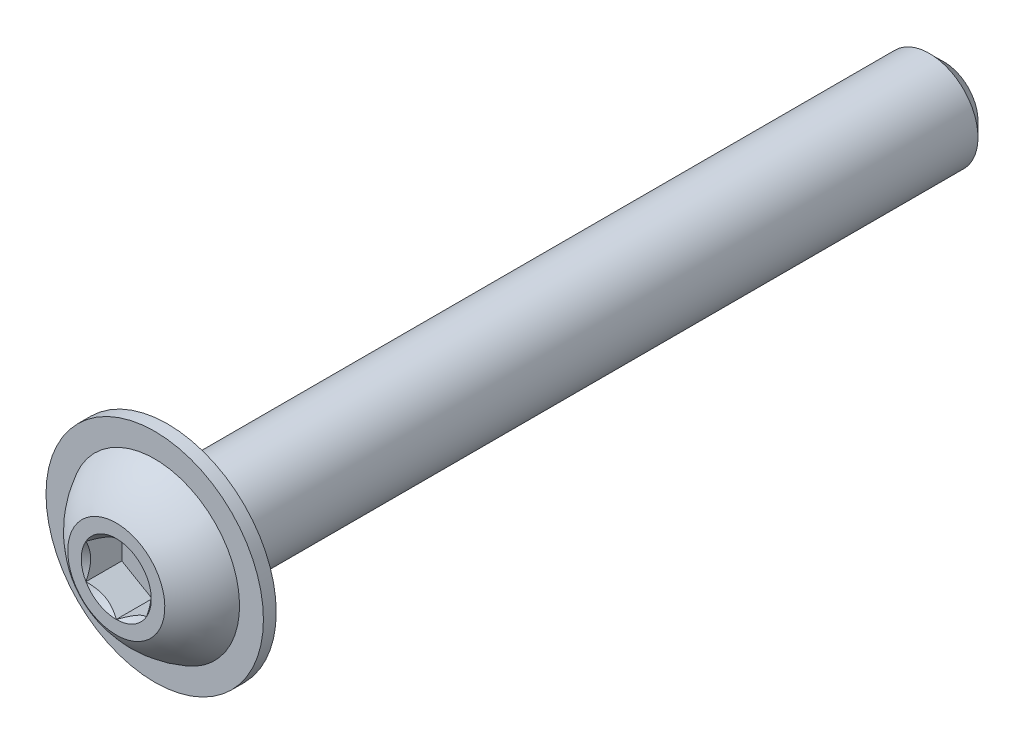
ISO-10303-21;
HEADER;
FILE_DESCRIPTION(('STEP AP214'),'2;1');
FILE_NAME('part.step','',(''),(''),'','','');
FILE_SCHEMA(('AUTOMOTIVE_DESIGN { 1 0 10303 214 1 1 1 1 }'));
ENDSEC;
DATA;
#1=APPLICATION_CONTEXT('core data for automotive mechanical design processes');
#2=APPLICATION_PROTOCOL_DEFINITION('international standard','automotive_design',2000,#1);
#3=PRODUCT_CONTEXT('',#1,'mechanical');
#4=PRODUCT('Part','Part','',(#3));
#5=PRODUCT_RELATED_PRODUCT_CATEGORY('part','',(#4));
#6=PRODUCT_DEFINITION_FORMATION('','',#4);
#7=PRODUCT_DEFINITION_CONTEXT('part definition',#1,'design');
#8=PRODUCT_DEFINITION('design','',#6,#7);
#9=PRODUCT_DEFINITION_SHAPE('','',#8);
#10=(LENGTH_UNIT() NAMED_UNIT(*) SI_UNIT(.MILLI.,.METRE.));
#11=(NAMED_UNIT(*) PLANE_ANGLE_UNIT() SI_UNIT($,.RADIAN.));
#12=(NAMED_UNIT(*) SI_UNIT($,.STERADIAN.) SOLID_ANGLE_UNIT());
#13=UNCERTAINTY_MEASURE_WITH_UNIT(LENGTH_MEASURE(1.E-05),#10,'distance_accuracy_value','');
#14=(GEOMETRIC_REPRESENTATION_CONTEXT(3) GLOBAL_UNCERTAINTY_ASSIGNED_CONTEXT((#13)) GLOBAL_UNIT_ASSIGNED_CONTEXT((#10,
#11,#12)) REPRESENTATION_CONTEXT('',''));
#15=CARTESIAN_POINT('',(0.,0.,0.));
#16=DIRECTION('',(0.,0.,1.));
#17=DIRECTION('',(1.,0.,0.));
#18=AXIS2_PLACEMENT_3D('',#15,#16,#17);
#19=CARTESIAN_POINT('',(0.,-3.175,-54.1528));
#20=DIRECTION('',(0.,0.,-1.));
#21=DIRECTION('',(0.,1.,0.));
#22=AXIS2_PLACEMENT_3D('',#19,#20,#21);
#23=PLANE('',#22);
#24=CARTESIAN_POINT('',(0.,0.,-54.1528));
#25=DIRECTION('',(0.,0.,-1.));
#26=DIRECTION('',(0.,1.,0.));
#27=AXIS2_PLACEMENT_3D('',#24,#25,#26);
#28=CIRCLE('',#27,2.2225);
#29=CARTESIAN_POINT('',(0.,-2.22249999999999,-54.1528));
#30=VERTEX_POINT('',#29);
#31=EDGE_CURVE('E176',#30,#30,#28,.T.);
#32=ORIENTED_EDGE('',*,*,#31,.T.);
#33=EDGE_LOOP('',(#32));
#34=FACE_BOUND('',#33,.T.);
#35=ADVANCED_FACE('F34',(#34),#23,.T.);
#36=CARTESIAN_POINT('',(0.,0.,-54.1528));
#37=DIRECTION('',(0.,0.,-1.));
#38=DIRECTION('',(0.,1.,0.));
#39=AXIS2_PLACEMENT_3D('',#36,#37,#38);
#40=CYLINDRICAL_SURFACE('',#39,3.175);
#41=CARTESIAN_POINT('',(0.,0.,-53.2003));
#42=DIRECTION('',(0.,0.,-1.));
#43=DIRECTION('',(0.,1.,0.));
#44=AXIS2_PLACEMENT_3D('',#41,#42,#43);
#45=CIRCLE('',#44,3.175);
#46=CARTESIAN_POINT('',(0.,-3.175,-53.2003));
#47=VERTEX_POINT('',#46);
#48=EDGE_CURVE('E47',#47,#47,#45,.F.);
#49=ORIENTED_EDGE('',*,*,#48,.T.);
#50=EDGE_LOOP('',(#49));
#51=FACE_BOUND('',#50,.T.);
#52=CARTESIAN_POINT('',(0.,0.,-3.3528));
#53=DIRECTION('',(0.,0.,1.));
#54=DIRECTION('',(1.,0.,0.));
#55=AXIS2_PLACEMENT_3D('',#52,#53,#54);
#56=CIRCLE('',#55,3.175);
#57=CARTESIAN_POINT('',(3.175,0.,-3.3528));
#58=VERTEX_POINT('',#57);
#59=EDGE_CURVE('E173',#58,#58,#56,.F.);
#60=ORIENTED_EDGE('',*,*,#59,.T.);
#61=EDGE_LOOP('',(#60));
#62=FACE_BOUND('',#61,.T.);
#63=ADVANCED_FACE('F181',(#51,#62),#40,.T.);
#64=CARTESIAN_POINT('',(0.,0.,-54.1528));
#65=DIRECTION('',(0.,0.,1.));
#66=DIRECTION('',(0.,-1.,0.));
#67=AXIS2_PLACEMENT_3D('',#64,#65,#66);
#68=CONICAL_SURFACE('',#67,2.2225,0.78539816339745);
#69=CARTESIAN_POINT('',(0.,-3.175,-53.2003));
#70=CARTESIAN_POINT('',(0.,-3.165078125,-53.210221875));
#71=CARTESIAN_POINT('',(0.,-3.15515625,-53.22014375));
#72=CARTESIAN_POINT('',(0.,-3.1353125,-53.2399875));
#73=CARTESIAN_POINT('',(0.,-3.12539062499999,-53.249909375));
#74=CARTESIAN_POINT('',(0.,-3.105546875,-53.269753125));
#75=CARTESIAN_POINT('',(0.,-3.095625,-53.279675));
#76=CARTESIAN_POINT('',(0.,-3.07578125,-53.29951875));
#77=CARTESIAN_POINT('',(0.,-3.06585937499999,-53.309440625));
#78=CARTESIAN_POINT('',(0.,-3.04601562499999,-53.329284375));
#79=CARTESIAN_POINT('',(0.,-3.03609375,-53.33920625));
#80=CARTESIAN_POINT('',(0.,-3.01625,-53.35905));
#81=CARTESIAN_POINT('',(0.,-3.006328125,-53.368971875));
#82=CARTESIAN_POINT('',(0.,-2.98648437499999,-53.388815625));
#83=CARTESIAN_POINT('',(0.,-2.97656249999999,-53.3987375));
#84=CARTESIAN_POINT('',(0.,-2.95671874999999,-53.41858125));
#85=CARTESIAN_POINT('',(0.,-2.946796875,-53.428503125));
#86=CARTESIAN_POINT('',(0.,-2.92695312499999,-53.448346875));
#87=CARTESIAN_POINT('',(0.,-2.91703124999999,-53.45826875));
#88=CARTESIAN_POINT('',(0.,-2.89718749999999,-53.4781125));
#89=CARTESIAN_POINT('',(0.,-2.887265625,-53.488034375));
#90=CARTESIAN_POINT('',(0.,-2.867421875,-53.507878125));
#91=CARTESIAN_POINT('',(0.,-2.85749999999999,-53.5178));
#92=CARTESIAN_POINT('',(0.,-2.83765624999999,-53.53764375));
#93=CARTESIAN_POINT('',(0.,-2.82773437499999,-53.547565625));
#94=CARTESIAN_POINT('',(0.,-2.80789062499999,-53.567409375));
#95=CARTESIAN_POINT('',(0.,-2.79796874999999,-53.57733125));
#96=CARTESIAN_POINT('',(0.,-2.77812499999999,-53.597175));
#97=CARTESIAN_POINT('',(0.,-2.76820312499999,-53.607096875));
#98=CARTESIAN_POINT('',(0.,-2.74835937499999,-53.626940625));
#99=CARTESIAN_POINT('',(0.,-2.73843749999999,-53.6368625));
#100=CARTESIAN_POINT('',(0.,-2.71859374999999,-53.65670625));
#101=CARTESIAN_POINT('',(0.,-2.70867187499999,-53.666628125));
#102=CARTESIAN_POINT('',(0.,-2.68882812499999,-53.686471875));
#103=CARTESIAN_POINT('',(0.,-2.67890624999999,-53.69639375));
#104=CARTESIAN_POINT('',(0.,-2.65906249999999,-53.7162375));
#105=CARTESIAN_POINT('',(0.,-2.64914062499999,-53.726159375));
#106=CARTESIAN_POINT('',(0.,-2.62929687499999,-53.746003125));
#107=CARTESIAN_POINT('',(0.,-2.61937499999999,-53.755925));
#108=CARTESIAN_POINT('',(0.,-2.59953124999999,-53.77576875));
#109=CARTESIAN_POINT('',(0.,-2.58960937499999,-53.785690625));
#110=CARTESIAN_POINT('',(0.,-2.56976562499999,-53.805534375));
#111=CARTESIAN_POINT('',(0.,-2.55984374999999,-53.81545625));
#112=CARTESIAN_POINT('',(0.,-2.53999999999999,-53.8353));
#113=CARTESIAN_POINT('',(0.,-2.53007812499999,-53.845221875));
#114=CARTESIAN_POINT('',(0.,-2.51023437499999,-53.865065625));
#115=CARTESIAN_POINT('',(0.,-2.50031249999999,-53.8749875));
#116=CARTESIAN_POINT('',(0.,-2.48046874999999,-53.89483125));
#117=CARTESIAN_POINT('',(0.,-2.47054687499999,-53.904753125));
#118=CARTESIAN_POINT('',(0.,-2.45070312499999,-53.924596875));
#119=CARTESIAN_POINT('',(0.,-2.44078124999999,-53.93451875));
#120=CARTESIAN_POINT('',(0.,-2.42093749999999,-53.9543625));
#121=CARTESIAN_POINT('',(0.,-2.41101562499999,-53.964284375));
#122=CARTESIAN_POINT('',(0.,-2.39117187499999,-53.984128125));
#123=CARTESIAN_POINT('',(0.,-2.38124999999999,-53.99405));
#124=CARTESIAN_POINT('',(0.,-2.36140624999999,-54.01389375));
#125=CARTESIAN_POINT('',(0.,-2.35148437499999,-54.023815625));
#126=CARTESIAN_POINT('',(0.,-2.33164062499999,-54.043659375));
#127=CARTESIAN_POINT('',(0.,-2.32171874999999,-54.05358125));
#128=CARTESIAN_POINT('',(0.,-2.30187499999999,-54.073425));
#129=CARTESIAN_POINT('',(0.,-2.29195312499999,-54.083346875));
#130=CARTESIAN_POINT('',(0.,-2.27210937499999,-54.103190625));
#131=CARTESIAN_POINT('',(0.,-2.26218749999999,-54.1131125));
#132=CARTESIAN_POINT('',(0.,-2.24234374999999,-54.13295625));
#133=CARTESIAN_POINT('',(0.,-2.23242187499999,-54.142878125));
#134=CARTESIAN_POINT('',(0.,-2.22249999999999,-54.1528));
#135=B_SPLINE_CURVE_WITH_KNOTS('',3,(#69,#70,#71,#72,#73,#74,#75,#76,#77,#78,#79,#80,#81,#82,
#83,#84,#85,#86,#87,#88,#89,#90,#91,#92,#93,#94,#95,#96,#97,#98,#99,#100,#101,#102,#103,#104,
#105,#106,#107,#108,#109,#110,#111,#112,#113,#114,#115,#116,#117,#118,#119,#120,#121,#122,#123,
#124,#125,#126,#127,#128,#129,#130,#131,#132,#133,#134),.UNSPECIFIED.,.F.,.F.,(4,2,2,2,2,2,2,2,
2,2,2,2,2,2,2,2,2,2,2,2,2,2,2,2,2,2,2,2,2,2,2,2,4),(0.,0.0420949505675148,0.0841899011350244,
0.126284851702539,0.168379802270049,0.210474752837564,0.252569703405074,0.294664653972583,
0.336759604540098,0.378854555107608,0.420949505675123,0.463044456242633,0.505139406810142,
0.547234357377657,0.589329307945167,0.631424258512682,0.673519209080192,0.715614159647701,
0.757709110215216,0.799804060782726,0.841899011350241,0.883993961917751,0.92608891248526,
0.968183863052775,1.01027881362029,1.0523737641878,1.09446871475531,1.13656366532282,
1.17865861589033,1.22075356645784,1.26284851702536,1.30494346759287,1.34703841816038),.UNSPECIFIED.);
#136=EDGE_CURVE('BSEAM36',#47,#30,#135,.T.);
#137=ORIENTED_EDGE('',*,*,#48,.F.);
#138=ORIENTED_EDGE('',*,*,#31,.F.);
#139=ORIENTED_EDGE('',*,*,#136,.T.);
#140=ORIENTED_EDGE('',*,*,#136,.F.);
#141=EDGE_LOOP('',(#137,#139,#138,#140));
#142=FACE_BOUND('',#141,.T.);
#143=ADVANCED_FACE('F36',(#142),#68,.T.);
#144=CARTESIAN_POINT('',(0.,-5.5499,-3.3528));
#145=DIRECTION('',(0.,0.,1.));
#146=DIRECTION('',(1.,0.,0.));
#147=AXIS2_PLACEMENT_3D('',#144,#145,#146);
#148=PLANE('',#147);
#149=ORIENTED_EDGE('',*,*,#59,.F.);
#150=EDGE_LOOP('',(#149));
#151=FACE_BOUND('',#150,.T.);
#152=CARTESIAN_POINT('',(0.,0.,-3.3528));
#153=DIRECTION('',(0.,0.,-1.));
#154=DIRECTION('',(-1.,0.,0.));
#155=AXIS2_PLACEMENT_3D('',#152,#153,#154);
#156=CIRCLE('',#155,7.112);
#157=CARTESIAN_POINT('',(-7.112,0.,-3.3528));
#158=VERTEX_POINT('',#157);
#159=EDGE_CURVE('E165',#158,#158,#156,.T.);
#160=ORIENTED_EDGE('',*,*,#159,.T.);
#161=EDGE_LOOP('',(#160));
#162=FACE_BOUND('',#161,.T.);
#163=ADVANCED_FACE('F186',(#151,#162),#148,.F.);
#164=CARTESIAN_POINT('',(0.,0.,-2.5146));
#165=DIRECTION('',(0.,0.,-1.));
#166=DIRECTION('',(-1.,0.,0.));
#167=AXIS2_PLACEMENT_3D('',#164,#165,#166);
#168=PLANE('',#167);
#169=CARTESIAN_POINT('',(0.,0.,-2.5146));
#170=DIRECTION('',(0.,0.,-1.));
#171=DIRECTION('',(-1.,0.,0.));
#172=AXIS2_PLACEMENT_3D('',#169,#170,#171);
#173=CIRCLE('',#172,7.112);
#174=CARTESIAN_POINT('',(-7.112,0.,-2.5146));
#175=VERTEX_POINT('',#174);
#176=EDGE_CURVE('E161',#175,#175,#173,.T.);
#177=ORIENTED_EDGE('',*,*,#176,.F.);
#178=EDGE_LOOP('',(#177));
#179=FACE_BOUND('',#178,.T.);
#180=CARTESIAN_POINT('',(0.,0.,-2.5146));
#181=DIRECTION('',(0.,0.,-1.));
#182=DIRECTION('',(-1.,0.,0.));
#183=AXIS2_PLACEMENT_3D('',#180,#181,#182);
#184=CIRCLE('',#183,5.5499);
#185=CARTESIAN_POINT('',(0.,-5.5499,-2.5146));
#186=VERTEX_POINT('',#185);
#187=EDGE_CURVE('E164',#186,#186,#184,.T.);
#188=ORIENTED_EDGE('',*,*,#187,.T.);
#189=EDGE_LOOP('',(#188));
#190=FACE_BOUND('',#189,.T.);
#191=ADVANCED_FACE('F204',(#179,#190),#168,.F.);
#192=CARTESIAN_POINT('',(0.,0.,-2.5146));
#193=DIRECTION('',(0.,0.,-1.));
#194=DIRECTION('',(-1.,0.,0.));
#195=AXIS2_PLACEMENT_3D('',#192,#193,#194);
#196=CYLINDRICAL_SURFACE('',#195,7.112);
#197=CARTESIAN_POINT('',(-7.112,0.,-2.5146));
#198=CARTESIAN_POINT('',(-7.112,0.,-2.52333125));
#199=CARTESIAN_POINT('',(-7.112,0.,-2.5320625));
#200=CARTESIAN_POINT('',(-7.112,0.,-2.549525));
#201=CARTESIAN_POINT('',(-7.112,0.,-2.55825625));
#202=CARTESIAN_POINT('',(-7.112,0.,-2.57571875));
#203=CARTESIAN_POINT('',(-7.112,0.,-2.58445));
#204=CARTESIAN_POINT('',(-7.112,0.,-2.6019125));
#205=CARTESIAN_POINT('',(-7.112,0.,-2.61064375));
#206=CARTESIAN_POINT('',(-7.112,0.,-2.62810625));
#207=CARTESIAN_POINT('',(-7.112,0.,-2.6368375));
#208=CARTESIAN_POINT('',(-7.112,0.,-2.6543));
#209=CARTESIAN_POINT('',(-7.112,0.,-2.66303125));
#210=CARTESIAN_POINT('',(-7.112,0.,-2.68049375));
#211=CARTESIAN_POINT('',(-7.112,0.,-2.689225));
#212=CARTESIAN_POINT('',(-7.112,0.,-2.7066875));
#213=CARTESIAN_POINT('',(-7.112,0.,-2.71541875));
#214=CARTESIAN_POINT('',(-7.112,0.,-2.73288125));
#215=CARTESIAN_POINT('',(-7.112,0.,-2.7416125));
#216=CARTESIAN_POINT('',(-7.112,0.,-2.759075));
#217=CARTESIAN_POINT('',(-7.112,0.,-2.76780625));
#218=CARTESIAN_POINT('',(-7.112,0.,-2.78526875));
#219=CARTESIAN_POINT('',(-7.112,0.,-2.794));
#220=CARTESIAN_POINT('',(-7.112,0.,-2.8114625));
#221=CARTESIAN_POINT('',(-7.112,0.,-2.82019375));
#222=CARTESIAN_POINT('',(-7.112,0.,-2.83765625));
#223=CARTESIAN_POINT('',(-7.112,0.,-2.8463875));
#224=CARTESIAN_POINT('',(-7.112,0.,-2.86385));
#225=CARTESIAN_POINT('',(-7.112,0.,-2.87258125));
#226=CARTESIAN_POINT('',(-7.112,0.,-2.89004375));
#227=CARTESIAN_POINT('',(-7.112,0.,-2.898775));
#228=CARTESIAN_POINT('',(-7.112,0.,-2.9162375));
#229=CARTESIAN_POINT('',(-7.112,0.,-2.92496875));
#230=CARTESIAN_POINT('',(-7.112,0.,-2.94243125));
#231=CARTESIAN_POINT('',(-7.112,0.,-2.9511625));
#232=CARTESIAN_POINT('',(-7.112,0.,-2.968625));
#233=CARTESIAN_POINT('',(-7.112,0.,-2.97735625));
#234=CARTESIAN_POINT('',(-7.112,0.,-2.99481875));
#235=CARTESIAN_POINT('',(-7.112,0.,-3.00355));
#236=CARTESIAN_POINT('',(-7.112,0.,-3.0210125));
#237=CARTESIAN_POINT('',(-7.112,0.,-3.02974375));
#238=CARTESIAN_POINT('',(-7.112,0.,-3.04720625));
#239=CARTESIAN_POINT('',(-7.112,0.,-3.0559375));
#240=CARTESIAN_POINT('',(-7.112,0.,-3.0734));
#241=CARTESIAN_POINT('',(-7.112,0.,-3.08213125));
#242=CARTESIAN_POINT('',(-7.112,0.,-3.09959375));
#243=CARTESIAN_POINT('',(-7.112,0.,-3.108325));
#244=CARTESIAN_POINT('',(-7.112,0.,-3.1257875));
#245=CARTESIAN_POINT('',(-7.112,0.,-3.13451875));
#246=CARTESIAN_POINT('',(-7.112,0.,-3.15198125));
#247=CARTESIAN_POINT('',(-7.112,0.,-3.1607125));
#248=CARTESIAN_POINT('',(-7.112,0.,-3.178175));
#249=CARTESIAN_POINT('',(-7.112,0.,-3.18690625));
#250=CARTESIAN_POINT('',(-7.112,0.,-3.20436875));
#251=CARTESIAN_POINT('',(-7.112,0.,-3.2131));
#252=CARTESIAN_POINT('',(-7.112,0.,-3.2305625));
#253=CARTESIAN_POINT('',(-7.112,0.,-3.23929375));
#254=CARTESIAN_POINT('',(-7.112,0.,-3.25675625));
#255=CARTESIAN_POINT('',(-7.112,0.,-3.2654875));
#256=CARTESIAN_POINT('',(-7.112,0.,-3.28295));
#257=CARTESIAN_POINT('',(-7.112,0.,-3.29168125));
#258=CARTESIAN_POINT('',(-7.112,0.,-3.30914375));
#259=CARTESIAN_POINT('',(-7.112,0.,-3.317875));
#260=CARTESIAN_POINT('',(-7.112,0.,-3.3353375));
#261=CARTESIAN_POINT('',(-7.112,0.,-3.34406875));
#262=CARTESIAN_POINT('',(-7.112,0.,-3.3528));
#263=B_SPLINE_CURVE_WITH_KNOTS('',3,(#197,#198,#199,#200,#201,#202,#203,#204,#205,#206,#207,
#208,#209,#210,#211,#212,#213,#214,#215,#216,#217,#218,#219,#220,#221,#222,#223,#224,#225,#226,
#227,#228,#229,#230,#231,#232,#233,#234,#235,#236,#237,#238,#239,#240,#241,#242,#243,#244,#245,
#246,#247,#248,#249,#250,#251,#252,#253,#254,#255,#256,#257,#258,#259,#260,#261,#262),
.UNSPECIFIED.,.F.,.F.,(4,2,2,2,2,2,2,2,2,2,2,2,2,2,2,2,2,2,2,2,2,2,2,2,2,2,2,2,2,2,2,2,4),(0.,
0.0261937500000003,0.0523875000000003,0.0785812500000002,0.104775,0.13096875,0.1571625,
0.18335625,0.20955,0.23574375,0.2619375,0.28813125,0.314325,0.34051875,0.3667125,0.39290625,
0.4191,0.44529375,0.4714875,0.49768125,0.523875,0.55006875,0.5762625,0.60245625,0.62865,
0.65484375,0.6810375,0.70723125,0.733425,0.75961875,0.7858125,0.812006249999999,0.8382),.UNSPECIFIED.);
#264=EDGE_CURVE('BSEAM201',#175,#158,#263,.T.);
#265=ORIENTED_EDGE('',*,*,#176,.T.);
#266=ORIENTED_EDGE('',*,*,#159,.F.);
#267=ORIENTED_EDGE('',*,*,#264,.T.);
#268=ORIENTED_EDGE('',*,*,#264,.F.);
#269=EDGE_LOOP('',(#265,#267,#266,#268));
#270=FACE_BOUND('',#269,.T.);
#271=ADVANCED_FACE('F201',(#270),#196,.T.);
#272=CARTESIAN_POINT('',(0.,-3.175,0.));
#273=DIRECTION('',(0.,0.,-1.));
#274=DIRECTION('',(-1.,0.,0.));
#275=AXIS2_PLACEMENT_3D('',#272,#273,#274);
#276=PLANE('',#275);
#277=CARTESIAN_POINT('',(0.,0.,0.));
#278=DIRECTION('',(0.,0.,1.));
#279=DIRECTION('',(1.,0.,0.));
#280=AXIS2_PLACEMENT_3D('',#277,#278,#279);
#281=CIRCLE('',#280,2.29135888084633);
#282=CARTESIAN_POINT('',(-1.984375,1.14567944042316,0.));
#283=VERTEX_POINT('',#282);
#284=CARTESIAN_POINT('',(-1.984375,-1.14567944042316,0.));
#285=VERTEX_POINT('',#284);
#286=EDGE_CURVE('E60',#283,#285,#281,.T.);
#287=ORIENTED_EDGE('',*,*,#286,.F.);
#288=CARTESIAN_POINT('',(0.,2.29135888084633,0.));
#289=VERTEX_POINT('',#288);
#290=EDGE_CURVE('E132',#289,#283,#281,.T.);
#291=ORIENTED_EDGE('',*,*,#290,.F.);
#292=CARTESIAN_POINT('',(1.984375,1.14567944042316,0.));
#293=VERTEX_POINT('',#292);
#294=EDGE_CURVE('E129',#293,#289,#281,.T.);
#295=ORIENTED_EDGE('',*,*,#294,.F.);
#296=CARTESIAN_POINT('',(1.984375,-1.14567944042316,0.));
#297=VERTEX_POINT('',#296);
#298=EDGE_CURVE('E100',#297,#293,#281,.T.);
#299=ORIENTED_EDGE('',*,*,#298,.F.);
#300=CARTESIAN_POINT('',(0.,-2.29135888084633,0.));
#301=VERTEX_POINT('',#300);
#302=EDGE_CURVE('E92',#301,#297,#281,.T.);
#303=ORIENTED_EDGE('',*,*,#302,.F.);
#304=EDGE_CURVE('E53',#285,#301,#281,.T.);
#305=ORIENTED_EDGE('',*,*,#304,.F.);
#306=EDGE_LOOP('',(#287,#291,#295,#299,#303,#305));
#307=FACE_BOUND('',#306,.T.);
#308=CARTESIAN_POINT('',(0.,0.,0.));
#309=DIRECTION('',(0.,0.,1.));
#310=DIRECTION('',(1.,0.,0.));
#311=AXIS2_PLACEMENT_3D('',#308,#309,#310);
#312=CIRCLE('',#311,3.175);
#313=CARTESIAN_POINT('',(0.,-3.175,0.));
#314=VERTEX_POINT('',#313);
#315=EDGE_CURVE('E170',#314,#314,#312,.T.);
#316=ORIENTED_EDGE('',*,*,#315,.T.);
#317=EDGE_LOOP('',(#316));
#318=FACE_BOUND('',#317,.T.);
#319=ADVANCED_FACE('F126',(#307,#318),#276,.F.);
#320=CARTESIAN_POINT('',(0.,0.,-5.37739166666666));
#321=DIRECTION('',(0.,0.,1.));
#322=DIRECTION('',(0.,-1.,0.));
#323=AXIS2_PLACEMENT_3D('',#320,#321,#322);
#324=SPHERICAL_SURFACE('',#323,6.24475509021259);
#325=CARTESIAN_POINT('',(0.,-3.175,0.));
#326=CARTESIAN_POINT('',(0.,-3.20643592869994,-0.0185608300517646));
#327=CARTESIAN_POINT('',(0.,-3.23770906265146,-0.0373973780299872));
#328=CARTESIAN_POINT('',(0.,-3.29992020375714,-0.07561598400899));
#329=CARTESIAN_POINT('',(0.,-3.33085821091131,-0.0949980420097703));
#330=CARTESIAN_POINT('',(0.,-3.39238956112179,-0.13430174220353));
#331=CARTESIAN_POINT('',(0.,-3.42298290417812,-0.15422338439651));
#332=CARTESIAN_POINT('',(0.,-3.48381552251841,-0.194600116229084));
#333=CARTESIAN_POINT('',(0.,-3.51405479780239,-0.215055205868679));
#334=CARTESIAN_POINT('',(0.,-3.57416997842277,-0.256492543824056));
#335=CARTESIAN_POINT('',(0.,-3.60404588375918,-0.277474792139838));
#336=CARTESIAN_POINT('',(0.,-3.66342513605284,-0.319959993312661));
#337=CARTESIAN_POINT('',(0.,-3.69292848301009,-0.3414629461697));
#338=CARTESIAN_POINT('',(0.,-3.75155354416926,-0.384982943003303));
#339=CARTESIAN_POINT('',(0.,-3.7806752583712,-0.406999986979867));
#340=CARTESIAN_POINT('',(0.,-3.8385280971637,-0.451541394281443));
#341=CARTESIAN_POINT('',(0.,-3.86725922175427,-0.474065757606455));
#342=CARTESIAN_POINT('',(0.,-3.92432204456246,-0.519614875861119));
#343=CARTESIAN_POINT('',(0.,-3.95265374278007,-0.54263963079077));
#344=CARTESIAN_POINT('',(0.,-4.00890899894141,-0.589182450590185));
#345=CARTESIAN_POINT('',(0.,-4.03683255688515,-0.61270051545995));
#346=CARTESIAN_POINT('',(0.,-4.09226294412568,-0.660222721753532));
#347=CARTESIAN_POINT('',(0.,-4.11976977342249,-0.68422686317735));
#348=CARTESIAN_POINT('',(0.,-4.17435824316894,-0.732713839690546));
#349=CARTESIAN_POINT('',(0.,-4.20143988361858,-0.757196674779924));
#350=CARTESIAN_POINT('',(0.,-4.25516964624445,-0.806633508505565));
#351=CARTESIAN_POINT('',(0.,-4.28181776842067,-0.831587507141828));
#352=CARTESIAN_POINT('',(0.,-4.33467229840953,-0.881958992927989));
#353=CARTESIAN_POINT('',(0.,-4.36087870622217,-0.907376480077888));
#354=CARTESIAN_POINT('',(0.,-4.41284174725056,-0.9586671253042));
#355=CARTESIAN_POINT('',(0.,-4.4385983804663,-0.984540283380613));
#356=CARTESIAN_POINT('',(0.,-4.48965395040355,-1.03673431272336));
#357=CARTESIAN_POINT('',(0.,-4.51495288712505,-1.0630551839897));
#358=CARTESIAN_POINT('',(0.,-4.56508528294891,-1.11613654427379));
#359=CARTESIAN_POINT('',(0.,-4.58991874205127,-1.14289703329154));
#360=CARTESIAN_POINT('',(0.,-4.63911254467763,-1.1968493984279));
#361=CARTESIAN_POINT('',(0.,-4.66347288820163,-1.22404127454652));
#362=CARTESIAN_POINT('',(0.,-4.71171296722693,-1.27884805055352));
#363=CARTESIAN_POINT('',(0.,-4.73559270272823,-1.3064629504419));
#364=CARTESIAN_POINT('',(0.,-4.78286422108308,-1.36210728054908));
#365=CARTESIAN_POINT('',(0.,-4.80625600393662,-1.39013671076787));
#366=CARTESIAN_POINT('',(0.,-4.85254442244916,-1.44660148060055));
#367=CARTESIAN_POINT('',(0.,-4.87544105810816,-1.47503682021443));
#368=CARTESIAN_POINT('',(0.,-4.92073213997594,-1.53230466305747));
#369=CARTESIAN_POINT('',(0.,-4.94312658618473,-1.56113716628664));
#370=CARTESIAN_POINT('',(0.,-4.98740640135317,-1.61919046842609));
#371=CARTESIAN_POINT('',(0.,-5.00929177031282,-1.64841126733638));
#372=CARTESIAN_POINT('',(0.,-5.05254669976077,-1.70723217347622));
#373=CARTESIAN_POINT('',(0.,-5.07391626024907,-1.73683228070577));
#374=CARTESIAN_POINT('',(0.,-5.11613300017333,-1.79640269946192));
#375=CARTESIAN_POINT('',(0.,-5.13698017960928,-1.82637301098853));
#376=CARTESIAN_POINT('',(0.,-5.17814574553232,-1.88667462044459));
#377=CARTESIAN_POINT('',(0.,-5.19846413201942,-1.91700591837406));
#378=CARTESIAN_POINT('',(0.,-5.23856586272349,-1.9780201717486));
#379=CARTESIAN_POINT('',(0.,-5.25834920694046,-2.00870312719367));
#380=CARTESIAN_POINT('',(0.,-5.297374768584,-2.07041125842494));
#381=CARTESIAN_POINT('',(0.,-5.31661698601056,-2.10143643421113));
#382=CARTESIAN_POINT('',(0.,-5.35455437509209,-2.16381946417543));
#383=CARTESIAN_POINT('',(0.,-5.37324954674706,-2.19517731835353));
#384=CARTESIAN_POINT('',(0.,-5.41008709689326,-2.25821605903608));
#385=CARTESIAN_POINT('',(0.,-5.42822947538451,-2.28989694554052));
#386=CARTESIAN_POINT('',(0.,-5.46395584938322,-2.35357201215651));
#387=CARTESIAN_POINT('',(0.,-5.4815398448907,-2.38556619226806));
#388=CARTESIAN_POINT('',(0.,-5.51614408130253,-2.44985798601348));
#389=CARTESIAN_POINT('',(0.,-5.53316432220688,-2.48215559964735));
#390=CARTESIAN_POINT('',(0.,-5.5499,-2.5146));
#391=B_SPLINE_CURVE_WITH_KNOTS('',3,(#325,#326,#327,#328,#329,#330,#331,#332,#333,#334,#335,
#336,#337,#338,#339,#340,#341,#342,#343,#344,#345,#346,#347,#348,#349,#350,#351,#352,#353,#354,
#355,#356,#357,#358,#359,#360,#361,#362,#363,#364,#365,#366,#367,#368,#369,#370,#371,#372,#373,
#374,#375,#376,#377,#378,#379,#380,#381,#382,#383,#384,#385,#386,#387,#388,#389,#390),
.UNSPECIFIED.,.F.,.F.,(4,2,2,2,2,2,2,2,2,2,2,2,2,2,2,2,2,2,2,2,2,2,2,2,2,2,2,2,2,2,2,2,4),(0.,
0.109517991230185,0.219035982460369,0.328553973690554,0.438071964920739,0.547589956150924,
0.657107947381109,0.766625938611292,0.876143929841477,0.985661921071661,1.09517991230185,
1.20469790353203,1.31421589476222,1.4237338859924,1.53325187722258,1.64276986845277,
1.75228785968295,1.86180585091314,1.97132384214332,2.08084183337351,2.19035982460369,
2.29987781583388,2.40939580706406,2.51891379829425,2.62843178952443,2.73794978075462,
2.8474677719848,2.95698576321499,3.06650375444517,3.17602174567535,3.28553973690554,
3.39505772813572,3.50457571936591),.UNSPECIFIED.);
#392=EDGE_CURVE('BSEAM195',#314,#186,#391,.T.);
#393=ORIENTED_EDGE('',*,*,#315,.F.);
#394=ORIENTED_EDGE('',*,*,#187,.F.);
#395=ORIENTED_EDGE('',*,*,#392,.T.);
#396=ORIENTED_EDGE('',*,*,#392,.F.);
#397=EDGE_LOOP('',(#393,#395,#394,#396));
#398=FACE_BOUND('',#397,.T.);
#399=ADVANCED_FACE('F195',(#398),#324,.T.);
#400=CARTESIAN_POINT('',(0.,0.,0.));
#401=DIRECTION('',(0.,0.,1.));
#402=DIRECTION('',(1.,0.,0.));
#403=AXIS2_PLACEMENT_3D('',#400,#401,#402);
#404=CONICAL_SURFACE('',#403,2.29135888084633,0.78539816339745);
#405=ORIENTED_EDGE('',*,*,#298,.T.);
#406=CARTESIAN_POINT('',(1.984375,-2.28495242157822,0.734984078816567));
#407=CARTESIAN_POINT('',(1.984375,-2.22931635455402,0.692986685550761));
#408=CARTESIAN_POINT('',(1.984375,-2.17336876548389,0.651396054076335));
#409=CARTESIAN_POINT('',(1.984375,-2.06072770258171,0.569208461471479));
#410=CARTESIAN_POINT('',(1.984375,-2.00403404503435,0.528611752405042));
#411=CARTESIAN_POINT('',(1.984375,-1.88936329173488,0.448303503174668));
#412=CARTESIAN_POINT('',(1.984375,-1.83137965519348,0.408601258813307));
#413=CARTESIAN_POINT('',(1.984375,-1.7144280213784,0.330685173401291));
#414=CARTESIAN_POINT('',(1.984375,-1.65546009407227,0.292471227194368));
#415=CARTESIAN_POINT('',(1.984375,-1.47005472306035,0.176252834013636));
#416=CARTESIAN_POINT('',(1.984375,-1.34163909427883,0.101347886872381));
#417=CARTESIAN_POINT('',(1.984375,-1.0784038470548,-0.0356697845602625));
#418=CARTESIAN_POINT('',(1.984375,-0.943607781407424,-0.0978256335176254));
#419=CARTESIAN_POINT('',(1.984375,-0.741275100444881,-0.173867421311382));
#420=CARTESIAN_POINT('',(1.984375,-0.676735408881095,-0.195691938673995));
#421=CARTESIAN_POINT('',(1.984375,-0.546098118112761,-0.234159536462205));
#422=CARTESIAN_POINT('',(1.984375,-0.480000411919955,-0.250802259934452));
#423=CARTESIAN_POINT('',(1.984375,-0.347746170028531,-0.277764619130277));
#424=CARTESIAN_POINT('',(1.984375,-0.281612071479122,-0.288192590264109));
#425=CARTESIAN_POINT('',(1.984375,-0.148636620052349,-0.302521852623404));
#426=CARTESIAN_POINT('',(1.984375,-0.0817953907393231,-0.306424265772614));
#427=CARTESIAN_POINT('',(1.984375,0.0495156750890649,-0.307412948667327));
#428=CARTESIAN_POINT('',(1.984375,0.113983775102992,-0.304740821124985));
#429=CARTESIAN_POINT('',(1.984375,0.242367515846177,-0.293260789502485));
#430=CARTESIAN_POINT('',(1.984375,0.30628310229592,-0.284452289360786));
#431=CARTESIAN_POINT('',(1.984375,0.434181040262184,-0.261030978667103));
#432=CARTESIAN_POINT('',(1.984375,0.49814502685831,-0.246319393767914));
#433=CARTESIAN_POINT('',(1.984375,0.624675616953008,-0.211873818587874));
#434=CARTESIAN_POINT('',(1.984375,0.687242336899689,-0.192140248550805));
#435=CARTESIAN_POINT('',(1.984375,0.884225483826088,-0.12258776276924));
#436=CARTESIAN_POINT('',(1.984375,1.01583674256468,-0.064847588743503));
#437=CARTESIAN_POINT('',(1.984375,1.27288659242652,0.0635303365887985));
#438=CARTESIAN_POINT('',(1.984375,1.3983008827048,0.134214424919413));
#439=CARTESIAN_POINT('',(1.984375,1.57956687990221,0.244516663813199));
#440=CARTESIAN_POINT('',(1.984375,1.63738271299424,0.280969829475364));
#441=CARTESIAN_POINT('',(1.984375,1.75202215386202,0.355415963291705));
#442=CARTESIAN_POINT('',(1.984375,1.80884568601362,0.393409048078055));
#443=CARTESIAN_POINT('',(1.984375,1.92116923084255,0.470338808893091));
#444=CARTESIAN_POINT('',(1.984375,1.97667624512253,0.509265313038791));
#445=CARTESIAN_POINT('',(1.984375,2.08693170717166,0.588147746121387));
#446=CARTESIAN_POINT('',(1.984375,2.14168035934793,0.62810338902403));
#447=CARTESIAN_POINT('',(1.984375,2.19611149046622,0.668480611285427));
#448=B_SPLINE_CURVE_WITH_KNOTS('',3,(#406,#407,#408,#409,#410,#411,#412,#413,#414,#415,#416,
#417,#418,#419,#420,#421,#422,#423,#424,#425,#426,#427,#428,#429,#430,#431,#432,#433,#434,#435,
#436,#437,#438,#439,#440,#441,#442,#443,#444,#445,#446,#447),.UNSPECIFIED.,.F.,.F.,(4,2,2,2,2,2,
2,2,2,2,2,2,2,2,2,2,2,2,2,2,4),(0.,0.209126070008322,0.418304637356569,0.629103979977992,
0.839888401371184,1.28549951116127,1.72957750768351,1.93379389749971,2.13802435186698,
2.33858179514333,2.53910475350639,2.73236963400794,2.92565329006887,3.12231577097487,
3.31896180041345,3.74886295245172,4.18033428125362,4.3853601718029,4.59040161996383,
4.79377749165108,4.99709743524131),.UNSPECIFIED.);
#449=EDGE_CURVE('E11',#297,#293,#448,.T.);
#450=ORIENTED_EDGE('',*,*,#449,.F.);
#451=EDGE_LOOP('',(#405,#450));
#452=FACE_BOUND('',#451,.T.);
#453=ADVANCED_FACE('F104',(#452),#404,.F.);
#454=ORIENTED_EDGE('',*,*,#294,.T.);
#455=CARTESIAN_POINT('',(1.984575,1.14556397036933,0.000115478781843379));
#456=CARTESIAN_POINT('',(1.9163590048332,1.18494849354192,-0.0392371477360852));
#457=CARTESIAN_POINT('',(1.84700231489303,1.22499159714897,-0.0762786895538154));
#458=CARTESIAN_POINT('',(1.70557619954781,1.30664400291398,-0.144101141576677));
#459=CARTESIAN_POINT('',(1.63349332126322,1.34826107209555,-0.174844310908246));
#460=CARTESIAN_POINT('',(1.488141602734,1.43217992591557,-0.227508111188786));
#461=CARTESIAN_POINT('',(1.41490978751306,1.47446033414663,-0.249561124120036));
#462=CARTESIAN_POINT('',(1.26683381740529,1.55995203534886,-0.283538507056124));
#463=CARTESIAN_POINT('',(1.19199418724658,1.60316071596705,-0.295488243908272));
#464=CARTESIAN_POINT('',(1.06301458545618,1.6776271237807,-0.306269900918094));
#465=CARTESIAN_POINT('',(1.00904128422756,1.7087886237741,-0.30786610094093));
#466=CARTESIAN_POINT('',(0.901182881480199,1.77106070163465,-0.305178161134708));
#467=CARTESIAN_POINT('',(0.847297817514476,1.80217125782056,-0.300891959659541));
#468=CARTESIAN_POINT('',(0.740036461751395,1.86409863044402,-0.286683126986481));
#469=CARTESIAN_POINT('',(0.686660807239859,1.89491507894443,-0.276754189547727));
#470=CARTESIAN_POINT('',(0.580832482591103,1.95601509066828,-0.251804915725461));
#471=CARTESIAN_POINT('',(0.528379742028898,1.9862986945516,-0.236784969610512));
#472=CARTESIAN_POINT('',(0.394017661036351,2.06387267818152,-0.19219214836433));
#473=CARTESIAN_POINT('',(0.312941642841675,2.11068193911104,-0.159257004061668));
#474=CARTESIAN_POINT('',(0.19372669327016,2.17951072233758,-0.103657558797803));
#475=CARTESIAN_POINT('',(0.154440075613998,2.20219286161692,-0.0841224079481377));
#476=CARTESIAN_POINT('',(0.0765946381319466,2.24713694590237,-0.0432712618805983));
#477=CARTESIAN_POINT('',(0.0380353888983007,2.26939913882716,-0.0219563604316494));
#478=CARTESIAN_POINT('',(-0.000200000000000694,2.29147435090017,0.000115478781842942));
#479=B_SPLINE_CURVE_WITH_KNOTS('',3,(#455,#456,#457,#458,#459,#460,#461,#462,#463,#464,#465,
#466,#467,#468,#469,#470,#471,#472,#473,#474,#475,#476,#477,#478),.UNSPECIFIED.,.F.,.F.,(4,2,2,
2,2,2,2,2,2,2,2,4),(0.,0.264339630306627,0.530219665093694,0.791876416371461,1.05287424418109,
1.239639843932,1.42647091743852,1.61351120244035,1.8005371524754,2.09764209964316,
2.24579179873714,2.39385111134157),.UNSPECIFIED.);
#480=EDGE_CURVE('E131',#293,#289,#479,.T.);
#481=ORIENTED_EDGE('',*,*,#480,.F.);
#482=EDGE_LOOP('',(#454,#481));
#483=FACE_BOUND('',#482,.T.);
#484=ADVANCED_FACE('F287',(#483),#404,.F.);
#485=ORIENTED_EDGE('',*,*,#290,.T.);
#486=CARTESIAN_POINT('',(0.00019999999999963,2.29147435090017,0.000115478781843248));
#487=CARTESIAN_POINT('',(-0.0680159951668028,2.25208982772757,-0.0392371477360846));
#488=CARTESIAN_POINT('',(-0.137372685106966,2.21204672412052,-0.0762786895538146));
#489=CARTESIAN_POINT('',(-0.278798800452187,2.13039431835551,-0.144101141576677));
#490=CARTESIAN_POINT('',(-0.350881678736783,2.08877724917394,-0.174844310908246));
#491=CARTESIAN_POINT('',(-0.496233397266004,2.00485839535392,-0.227508111188786));
#492=CARTESIAN_POINT('',(-0.569465212486938,1.96257798712287,-0.249561124120036));
#493=CARTESIAN_POINT('',(-0.717541182594706,1.87708628592063,-0.283538507056124));
#494=CARTESIAN_POINT('',(-0.792380812753424,1.83387760530244,-0.295488243908272));
#495=CARTESIAN_POINT('',(-0.921360414543816,1.75941119748879,-0.306269900918094));
#496=CARTESIAN_POINT('',(-0.975333715772443,1.72824969749539,-0.30786610094093));
#497=CARTESIAN_POINT('',(-1.0831921185198,1.66597761963484,-0.305178161134707));
#498=CARTESIAN_POINT('',(-1.13707718248552,1.63486706344893,-0.300891959659541));
#499=CARTESIAN_POINT('',(-1.2443385382486,1.57293969082547,-0.286683126986481));
#500=CARTESIAN_POINT('',(-1.29771419276014,1.54212324232506,-0.276754189547727));
#501=CARTESIAN_POINT('',(-1.4035425174089,1.48102323060122,-0.251804915725461));
#502=CARTESIAN_POINT('',(-1.4559952579711,1.45073962671789,-0.236784969610512));
#503=CARTESIAN_POINT('',(-1.59035733896365,1.37316564308797,-0.19219214836433));
#504=CARTESIAN_POINT('',(-1.67143335715832,1.32635638215845,-0.159257004061668));
#505=CARTESIAN_POINT('',(-1.79064830672984,1.25752759893191,-0.103657558797804));
#506=CARTESIAN_POINT('',(-1.829934924386,1.23484545965257,-0.0841224079481378));
#507=CARTESIAN_POINT('',(-1.90778036186805,1.18990137536713,-0.0432712618805984));
#508=CARTESIAN_POINT('',(-1.9463396111017,1.16763918244233,-0.0219563604316494));
#509=CARTESIAN_POINT('',(-1.984575,1.14556397036933,0.000115478781843052));
#510=B_SPLINE_CURVE_WITH_KNOTS('',3,(#486,#487,#488,#489,#490,#491,#492,#493,#494,#495,#496,
#497,#498,#499,#500,#501,#502,#503,#504,#505,#506,#507,#508,#509),.UNSPECIFIED.,.F.,.F.,(4,2,2,
2,2,2,2,2,2,2,2,4),(0.,0.264339630306626,0.530219665093694,0.79187641637146,1.05287424418109,
1.239639843932,1.42647091743852,1.61351120244035,1.8005371524754,2.09764209964316,
2.24579179873714,2.39385111134157),.UNSPECIFIED.);
#511=EDGE_CURVE('E136',#289,#283,#510,.T.);
#512=ORIENTED_EDGE('',*,*,#511,.F.);
#513=EDGE_LOOP('',(#485,#512));
#514=FACE_BOUND('',#513,.T.);
#515=ADVANCED_FACE('F139',(#514),#404,.F.);
#516=ORIENTED_EDGE('',*,*,#286,.T.);
#517=CARTESIAN_POINT('',(-1.984375,-2.28495242157823,0.734984078816569));
#518=CARTESIAN_POINT('',(-1.984375,-2.22931635455402,0.692986685550762));
#519=CARTESIAN_POINT('',(-1.984375,-2.17336876548389,0.651396054076336));
#520=CARTESIAN_POINT('',(-1.984375,-2.06072770258171,0.56920846147148));
#521=CARTESIAN_POINT('',(-1.984375,-2.00403404503435,0.528611752405043));
#522=CARTESIAN_POINT('',(-1.984375,-1.88936329173489,0.448303503174669));
#523=CARTESIAN_POINT('',(-1.984375,-1.83137965519348,0.408601258813308));
#524=CARTESIAN_POINT('',(-1.984375,-1.7144280213784,0.330685173401292));
#525=CARTESIAN_POINT('',(-1.984375,-1.65546009407228,0.292471227194368));
#526=CARTESIAN_POINT('',(-1.984375,-1.47005472306035,0.176252834013636));
#527=CARTESIAN_POINT('',(-1.984375,-1.34163909427883,0.101347886872382));
#528=CARTESIAN_POINT('',(-1.984375,-1.0784038470548,-0.0356697845602624));
#529=CARTESIAN_POINT('',(-1.984375,-0.943607781407425,-0.0978256335176256));
#530=CARTESIAN_POINT('',(-1.984375,-0.741275100444882,-0.173867421311381));
#531=CARTESIAN_POINT('',(-1.984375,-0.676735408881095,-0.195691938673995));
#532=CARTESIAN_POINT('',(-1.984375,-0.546098118112762,-0.234159536462205));
#533=CARTESIAN_POINT('',(-1.984375,-0.480000411919956,-0.250802259934452));
#534=CARTESIAN_POINT('',(-1.984375,-0.347746170028532,-0.277764619130277));
#535=CARTESIAN_POINT('',(-1.984375,-0.281612071479123,-0.288192590264108));
#536=CARTESIAN_POINT('',(-1.984375,-0.14863662005235,-0.302521852623404));
#537=CARTESIAN_POINT('',(-1.984375,-0.0817953907393237,-0.306424265772614));
#538=CARTESIAN_POINT('',(-1.984375,0.0495156750890643,-0.307412948667328));
#539=CARTESIAN_POINT('',(-1.984375,0.113983775102991,-0.304740821124985));
#540=CARTESIAN_POINT('',(-1.984375,0.242367515846177,-0.293260789502485));
#541=CARTESIAN_POINT('',(-1.984375,0.306283102295919,-0.284452289360786));
#542=CARTESIAN_POINT('',(-1.984375,0.434181040262184,-0.261030978667103));
#543=CARTESIAN_POINT('',(-1.984375,0.498145026858309,-0.246319393767914));
#544=CARTESIAN_POINT('',(-1.984375,0.624675616953007,-0.211873818587874));
#545=CARTESIAN_POINT('',(-1.984375,0.687242336899689,-0.192140248550805));
#546=CARTESIAN_POINT('',(-1.984375,0.884225483826087,-0.12258776276924));
#547=CARTESIAN_POINT('',(-1.984375,1.01583674256468,-0.0648475887435036));
#548=CARTESIAN_POINT('',(-1.984375,1.27288659242652,0.0635303365887976));
#549=CARTESIAN_POINT('',(-1.984375,1.3983008827048,0.134214424919412));
#550=CARTESIAN_POINT('',(-1.984375,1.57956687990221,0.244516663813198));
#551=CARTESIAN_POINT('',(-1.984375,1.63738271299424,0.280969829475363));
#552=CARTESIAN_POINT('',(-1.984375,1.75202215386202,0.355415963291704));
#553=CARTESIAN_POINT('',(-1.984375,1.80884568601362,0.393409048078054));
#554=CARTESIAN_POINT('',(-1.984375,1.92116923084255,0.47033880889309));
#555=CARTESIAN_POINT('',(-1.984375,1.97667624512253,0.509265313038791));
#556=CARTESIAN_POINT('',(-1.984375,2.08693170717166,0.588147746121386));
#557=CARTESIAN_POINT('',(-1.984375,2.14168035934793,0.628103389024029));
#558=CARTESIAN_POINT('',(-1.984375,2.19611149046622,0.668480611285426));
#559=B_SPLINE_CURVE_WITH_KNOTS('',3,(#517,#518,#519,#520,#521,#522,#523,#524,#525,#526,#527,
#528,#529,#530,#531,#532,#533,#534,#535,#536,#537,#538,#539,#540,#541,#542,#543,#544,#545,#546,
#547,#548,#549,#550,#551,#552,#553,#554,#555,#556,#557,#558),.UNSPECIFIED.,.F.,.F.,(4,2,2,2,2,2,
2,2,2,2,2,2,2,2,2,2,2,2,2,2,4),(0.,0.209126070008322,0.41830463735657,0.629103979977993,
0.839888401371186,1.28549951116127,1.72957750768351,1.93379389749972,2.13802435186698,
2.33858179514334,2.53910475350639,2.73236963400794,2.92565329006887,3.12231577097488,
3.31896180041345,3.74886295245172,4.18033428125362,4.3853601718029,4.59040161996383,
4.79377749165108,4.99709743524131),.UNSPECIFIED.);
#560=EDGE_CURVE('E143',#283,#285,#559,.F.);
#561=ORIENTED_EDGE('',*,*,#560,.F.);
#562=EDGE_LOOP('',(#516,#561));
#563=FACE_BOUND('',#562,.T.);
#564=ADVANCED_FACE('F281',(#563),#404,.F.);
#565=ORIENTED_EDGE('',*,*,#304,.T.);
#566=CARTESIAN_POINT('',(-1.984575,-1.14556397036933,0.000115478781843379));
#567=CARTESIAN_POINT('',(-1.9163590048332,-1.18494849354192,-0.0392371477360849));
#568=CARTESIAN_POINT('',(-1.84700231489303,-1.22499159714897,-0.076278689553815));
#569=CARTESIAN_POINT('',(-1.70557619954781,-1.30664400291398,-0.144101141576677));
#570=CARTESIAN_POINT('',(-1.63349332126322,-1.34826107209555,-0.174844310908246));
#571=CARTESIAN_POINT('',(-1.488141602734,-1.43217992591557,-0.227508111188786));
#572=CARTESIAN_POINT('',(-1.41490978751306,-1.47446033414663,-0.249561124120036));
#573=CARTESIAN_POINT('',(-1.26683381740529,-1.55995203534886,-0.283538507056124));
#574=CARTESIAN_POINT('',(-1.19199418724658,-1.60316071596705,-0.295488243908271));
#575=CARTESIAN_POINT('',(-1.06301458545618,-1.6776271237807,-0.306269900918094));
#576=CARTESIAN_POINT('',(-1.00904128422756,-1.7087886237741,-0.30786610094093));
#577=CARTESIAN_POINT('',(-0.901182881480199,-1.77106070163465,-0.305178161134708));
#578=CARTESIAN_POINT('',(-0.847297817514476,-1.80217125782056,-0.300891959659541));
#579=CARTESIAN_POINT('',(-0.740036461751395,-1.86409863044402,-0.286683126986481));
#580=CARTESIAN_POINT('',(-0.686660807239859,-1.89491507894443,-0.276754189547727));
#581=CARTESIAN_POINT('',(-0.580832482591103,-1.95601509066828,-0.251804915725461));
#582=CARTESIAN_POINT('',(-0.528379742028898,-1.9862986945516,-0.236784969610511));
#583=CARTESIAN_POINT('',(-0.394017661036351,-2.06387267818152,-0.19219214836433));
#584=CARTESIAN_POINT('',(-0.312941642841675,-2.11068193911104,-0.159257004061667));
#585=CARTESIAN_POINT('',(-0.19372669327016,-2.17951072233758,-0.103657558797803));
#586=CARTESIAN_POINT('',(-0.154440075613999,-2.20219286161692,-0.0841224079481375));
#587=CARTESIAN_POINT('',(-0.076594638131947,-2.24713694590237,-0.0432712618805984));
#588=CARTESIAN_POINT('',(-0.0380353888983012,-2.26939913882716,-0.0219563604316496));
#589=CARTESIAN_POINT('',(0.000200000000000172,-2.29147435090017,0.000115478781842942));
#590=B_SPLINE_CURVE_WITH_KNOTS('',3,(#566,#567,#568,#569,#570,#571,#572,#573,#574,#575,#576,
#577,#578,#579,#580,#581,#582,#583,#584,#585,#586,#587,#588,#589),.UNSPECIFIED.,.F.,.F.,(4,2,2,
2,2,2,2,2,2,2,2,4),(0.,0.264339630306627,0.530219665093694,0.79187641637146,1.05287424418109,
1.239639843932,1.42647091743852,1.61351120244035,1.8005371524754,2.09764209964316,
2.24579179873714,2.39385111134157),.UNSPECIFIED.);
#591=EDGE_CURVE('E116',#285,#301,#590,.T.);
#592=ORIENTED_EDGE('',*,*,#591,.F.);
#593=EDGE_LOOP('',(#565,#592));
#594=FACE_BOUND('',#593,.T.);
#595=ADVANCED_FACE('F232',(#594),#404,.F.);
#596=ORIENTED_EDGE('',*,*,#302,.T.);
#597=CARTESIAN_POINT('',(-0.000199999999999828,-2.29147435090017,0.000115478781843248));
#598=CARTESIAN_POINT('',(0.0680159951668025,-2.25208982772757,-0.0392371477360854));
#599=CARTESIAN_POINT('',(0.137372685106966,-2.21204672412052,-0.0762786895538154));
#600=CARTESIAN_POINT('',(0.278798800452188,-2.13039431835551,-0.144101141576677));
#601=CARTESIAN_POINT('',(0.350881678736783,-2.08877724917394,-0.174844310908246));
#602=CARTESIAN_POINT('',(0.496233397266004,-2.00485839535392,-0.227508111188786));
#603=CARTESIAN_POINT('',(0.569465212486939,-1.96257798712287,-0.249561124120036));
#604=CARTESIAN_POINT('',(0.717541182594706,-1.87708628592063,-0.283538507056124));
#605=CARTESIAN_POINT('',(0.792380812753425,-1.83387760530244,-0.295488243908272));
#606=CARTESIAN_POINT('',(0.921360414543816,-1.75941119748879,-0.306269900918094));
#607=CARTESIAN_POINT('',(0.975333715772443,-1.72824969749539,-0.30786610094093));
#608=CARTESIAN_POINT('',(1.0831921185198,-1.66597761963484,-0.305178161134708));
#609=CARTESIAN_POINT('',(1.13707718248552,-1.63486706344893,-0.300891959659541));
#610=CARTESIAN_POINT('',(1.2443385382486,-1.57293969082547,-0.286683126986481));
#611=CARTESIAN_POINT('',(1.29771419276014,-1.54212324232506,-0.276754189547727));
#612=CARTESIAN_POINT('',(1.4035425174089,-1.48102323060122,-0.251804915725462));
#613=CARTESIAN_POINT('',(1.4559952579711,-1.45073962671789,-0.236784969610512));
#614=CARTESIAN_POINT('',(1.59035733896365,-1.37316564308797,-0.192192148364331));
#615=CARTESIAN_POINT('',(1.67143335715832,-1.32635638215845,-0.159257004061668));
#616=CARTESIAN_POINT('',(1.79064830672984,-1.25752759893191,-0.103657558797804));
#617=CARTESIAN_POINT('',(1.829934924386,-1.23484545965257,-0.0841224079481382));
#618=CARTESIAN_POINT('',(1.90778036186805,-1.18990137536712,-0.043271261880599));
#619=CARTESIAN_POINT('',(1.9463396111017,-1.16763918244233,-0.0219563604316501));
#620=CARTESIAN_POINT('',(1.984575,-1.14556397036932,0.000115478781842488));
#621=B_SPLINE_CURVE_WITH_KNOTS('',3,(#597,#598,#599,#600,#601,#602,#603,#604,#605,#606,#607,
#608,#609,#610,#611,#612,#613,#614,#615,#616,#617,#618,#619,#620),.UNSPECIFIED.,.F.,.F.,(4,2,2,
2,2,2,2,2,2,2,2,4),(0.,0.264339630306627,0.530219665093694,0.791876416371461,1.05287424418109,
1.239639843932,1.42647091743852,1.61351120244035,1.8005371524754,2.09764209964316,
2.24579179873714,2.39385111134157),.UNSPECIFIED.);
#622=EDGE_CURVE('E96',#301,#297,#621,.T.);
#623=ORIENTED_EDGE('',*,*,#622,.F.);
#624=EDGE_LOOP('',(#596,#623));
#625=FACE_BOUND('',#624,.T.);
#626=ADVANCED_FACE('F94',(#625),#404,.F.);
#627=CARTESIAN_POINT('',(1.984375,-1.14567944042316,-2.34696));
#628=DIRECTION('',(0.,0.,1.));
#629=DIRECTION('',(1.,0.,0.));
#630=AXIS2_PLACEMENT_3D('',#627,#628,#629);
#631=PLANE('',#630);
#632=DIRECTION('',(0.866025403784439,0.5,0.));
#633=VECTOR('',#632,1.);
#634=CARTESIAN_POINT('',(0.,-2.29135888084633,-2.34696));
#635=LINE('',#634,#633);
#636=CARTESIAN_POINT('',(0.,-2.29135888084633,-2.34696));
#637=VERTEX_POINT('',#636);
#638=CARTESIAN_POINT('',(1.984375,-1.14567944042316,-2.34696));
#639=VERTEX_POINT('',#638);
#640=EDGE_CURVE('E115',#637,#639,#635,.T.);
#641=ORIENTED_EDGE('',*,*,#640,.T.);
#642=DIRECTION('',(0.,1.,0.));
#643=VECTOR('',#642,1.);
#644=CARTESIAN_POINT('',(1.984375,-1.14567944042316,-2.34696));
#645=LINE('',#644,#643);
#646=CARTESIAN_POINT('',(1.984375,1.14567944042316,-2.34696));
#647=VERTEX_POINT('',#646);
#648=EDGE_CURVE('E120',#639,#647,#645,.T.);
#649=ORIENTED_EDGE('',*,*,#648,.T.);
#650=DIRECTION('',(-0.866025403784439,0.5,0.));
#651=VECTOR('',#650,1.);
#652=CARTESIAN_POINT('',(1.984375,1.14567944042316,-2.34696));
#653=LINE('',#652,#651);
#654=CARTESIAN_POINT('',(0.,2.29135888084633,-2.34696));
#655=VERTEX_POINT('',#654);
#656=EDGE_CURVE('E271',#647,#655,#653,.T.);
#657=ORIENTED_EDGE('',*,*,#656,.T.);
#658=DIRECTION('',(-0.866025403784438,-0.5,0.));
#659=VECTOR('',#658,1.);
#660=CARTESIAN_POINT('',(0.,2.29135888084633,-2.34696));
#661=LINE('',#660,#659);
#662=CARTESIAN_POINT('',(-1.984375,1.14567944042316,-2.34696));
#663=VERTEX_POINT('',#662);
#664=EDGE_CURVE('E152',#655,#663,#661,.T.);
#665=ORIENTED_EDGE('',*,*,#664,.T.);
#666=DIRECTION('',(0.,-1.,0.));
#667=VECTOR('',#666,1.);
#668=CARTESIAN_POINT('',(-1.984375,1.14567944042316,-2.34696));
#669=LINE('',#668,#667);
#670=CARTESIAN_POINT('',(-1.984375,-1.14567944042316,-2.34696));
#671=VERTEX_POINT('',#670);
#672=EDGE_CURVE('E275',#663,#671,#669,.T.);
#673=ORIENTED_EDGE('',*,*,#672,.T.);
#674=DIRECTION('',(0.866025403784439,-0.5,0.));
#675=VECTOR('',#674,1.);
#676=CARTESIAN_POINT('',(-1.984375,-1.14567944042316,-2.34696));
#677=LINE('',#676,#675);
#678=EDGE_CURVE('E123',#671,#637,#677,.T.);
#679=ORIENTED_EDGE('',*,*,#678,.T.);
#680=EDGE_LOOP('',(#641,#649,#657,#665,#673,#679));
#681=FACE_BOUND('',#680,.T.);
#682=ADVANCED_FACE('F231',(#681),#631,.T.);
#683=CARTESIAN_POINT('',(1.984375,-1.14567944042316,-2.34696));
#684=DIRECTION('',(1.,0.,0.));
#685=DIRECTION('',(0.,0.,-1.));
#686=AXIS2_PLACEMENT_3D('',#683,#684,#685);
#687=PLANE('',#686);
#688=DIRECTION('',(0.,0.,1.));
#689=VECTOR('',#688,1.);
#690=CARTESIAN_POINT('',(1.984375,-1.14567944042316,-2.34696));
#691=LINE('',#690,#689);
#692=EDGE_CURVE('E112',#639,#297,#691,.T.);
#693=ORIENTED_EDGE('',*,*,#692,.T.);
#694=ORIENTED_EDGE('',*,*,#449,.T.);
#695=DIRECTION('',(0.,0.,1.));
#696=VECTOR('',#695,1.);
#697=CARTESIAN_POINT('',(1.984375,1.14567944042316,-2.34696));
#698=LINE('',#697,#696);
#699=EDGE_CURVE('E122',#647,#293,#698,.T.);
#700=ORIENTED_EDGE('',*,*,#699,.F.);
#701=ORIENTED_EDGE('',*,*,#648,.F.);
#702=EDGE_LOOP('',(#693,#694,#700,#701));
#703=FACE_BOUND('',#702,.T.);
#704=ADVANCED_FACE('F118',(#703),#687,.F.);
#705=CARTESIAN_POINT('',(1.984375,1.14567944042316,-2.34696));
#706=DIRECTION('',(0.5,0.866025403784439,0.));
#707=DIRECTION('',(-0.866025403784439,0.5,0.));
#708=AXIS2_PLACEMENT_3D('',#705,#706,#707);
#709=PLANE('',#708);
#710=ORIENTED_EDGE('',*,*,#699,.T.);
#711=ORIENTED_EDGE('',*,*,#480,.T.);
#712=DIRECTION('',(0.,0.,1.));
#713=VECTOR('',#712,1.);
#714=CARTESIAN_POINT('',(0.,2.29135888084633,-2.34696));
#715=LINE('',#714,#713);
#716=EDGE_CURVE('E148',#655,#289,#715,.T.);
#717=ORIENTED_EDGE('',*,*,#716,.F.);
#718=ORIENTED_EDGE('',*,*,#656,.F.);
#719=EDGE_LOOP('',(#710,#711,#717,#718));
#720=FACE_BOUND('',#719,.T.);
#721=ADVANCED_FACE('F146',(#720),#709,.F.);
#722=CARTESIAN_POINT('',(0.,2.29135888084633,-2.34696));
#723=DIRECTION('',(-0.5,0.866025403784438,0.));
#724=DIRECTION('',(-0.866025403784439,-0.5,0.));
#725=AXIS2_PLACEMENT_3D('',#722,#723,#724);
#726=PLANE('',#725);
#727=ORIENTED_EDGE('',*,*,#716,.T.);
#728=ORIENTED_EDGE('',*,*,#511,.T.);
#729=DIRECTION('',(0.,0.,1.));
#730=VECTOR('',#729,1.);
#731=CARTESIAN_POINT('',(-1.984375,1.14567944042316,-2.34696));
#732=LINE('',#731,#730);
#733=EDGE_CURVE('E154',#663,#283,#732,.T.);
#734=ORIENTED_EDGE('',*,*,#733,.F.);
#735=ORIENTED_EDGE('',*,*,#664,.F.);
#736=EDGE_LOOP('',(#727,#728,#734,#735));
#737=FACE_BOUND('',#736,.T.);
#738=ADVANCED_FACE('F150',(#737),#726,.F.);
#739=CARTESIAN_POINT('',(-1.984375,1.14567944042316,-2.34696));
#740=DIRECTION('',(-1.,0.,0.));
#741=DIRECTION('',(0.,0.,1.));
#742=AXIS2_PLACEMENT_3D('',#739,#740,#741);
#743=PLANE('',#742);
#744=ORIENTED_EDGE('',*,*,#733,.T.);
#745=ORIENTED_EDGE('',*,*,#560,.T.);
#746=DIRECTION('',(0.,0.,1.));
#747=VECTOR('',#746,1.);
#748=CARTESIAN_POINT('',(-1.984375,-1.14567944042316,-2.34696));
#749=LINE('',#748,#747);
#750=EDGE_CURVE('E156',#671,#285,#749,.T.);
#751=ORIENTED_EDGE('',*,*,#750,.F.);
#752=ORIENTED_EDGE('',*,*,#672,.F.);
#753=EDGE_LOOP('',(#744,#745,#751,#752));
#754=FACE_BOUND('',#753,.T.);
#755=ADVANCED_FACE('F250',(#754),#743,.F.);
#756=CARTESIAN_POINT('',(-1.984375,-1.14567944042316,-2.34696));
#757=DIRECTION('',(-0.5,-0.866025403784439,0.));
#758=DIRECTION('',(0.866025403784439,-0.5,0.));
#759=AXIS2_PLACEMENT_3D('',#756,#757,#758);
#760=PLANE('',#759);
#761=ORIENTED_EDGE('',*,*,#750,.T.);
#762=ORIENTED_EDGE('',*,*,#591,.T.);
#763=DIRECTION('',(0.,0.,1.));
#764=VECTOR('',#763,1.);
#765=CARTESIAN_POINT('',(0.,-2.29135888084633,-2.34696));
#766=LINE('',#765,#764);
#767=EDGE_CURVE('E114',#637,#301,#766,.T.);
#768=ORIENTED_EDGE('',*,*,#767,.F.);
#769=ORIENTED_EDGE('',*,*,#678,.F.);
#770=EDGE_LOOP('',(#761,#762,#768,#769));
#771=FACE_BOUND('',#770,.T.);
#772=ADVANCED_FACE('F214',(#771),#760,.F.);
#773=CARTESIAN_POINT('',(0.,-2.29135888084633,-2.34696));
#774=DIRECTION('',(0.5,-0.866025403784438,0.));
#775=DIRECTION('',(0.866025403784438,0.5,0.));
#776=AXIS2_PLACEMENT_3D('',#773,#774,#775);
#777=PLANE('',#776);
#778=ORIENTED_EDGE('',*,*,#767,.T.);
#779=ORIENTED_EDGE('',*,*,#622,.T.);
#780=ORIENTED_EDGE('',*,*,#692,.F.);
#781=ORIENTED_EDGE('',*,*,#640,.F.);
#782=EDGE_LOOP('',(#778,#779,#780,#781));
#783=FACE_BOUND('',#782,.T.);
#784=ADVANCED_FACE('F110',(#783),#777,.F.);
#785=CLOSED_SHELL('',(#35,#63,#143,#163,#191,#271,#319,#399,#453,#484,#515,#564,#595,#626,#682,
#704,#721,#738,#755,#772,#784));
#786=MANIFOLD_SOLID_BREP('B2',#785);
#787=ADVANCED_BREP_SHAPE_REPRESENTATION('',(#18,#786),#14);
#788=SHAPE_DEFINITION_REPRESENTATION(#9,#787);
ENDSEC;
END-ISO-10303-21;
